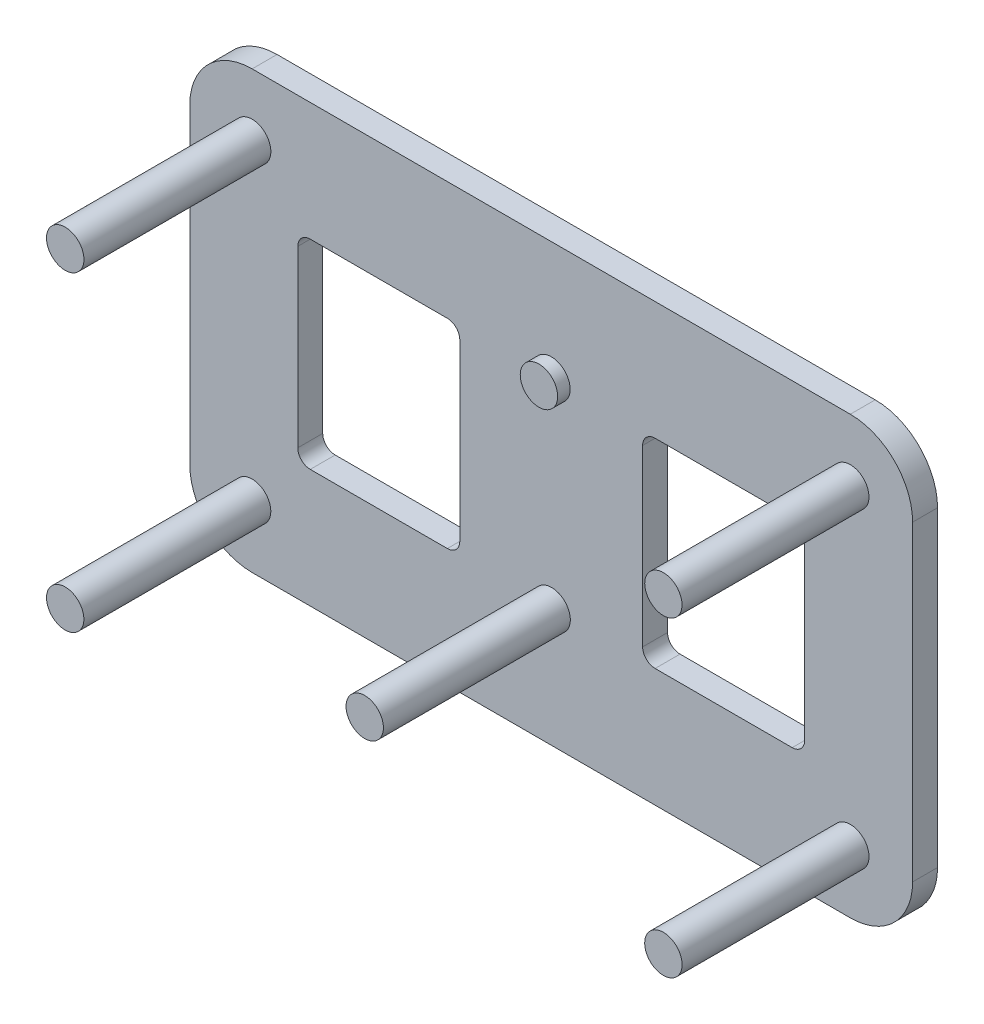
ISO-10303-21;
HEADER;
FILE_DESCRIPTION(('STEP AP214'),'2;1');
FILE_NAME('part.step','',(''),(''),'','','');
FILE_SCHEMA(('AUTOMOTIVE_DESIGN { 1 0 10303 214 1 1 1 1 }'));
ENDSEC;
DATA;
#1=APPLICATION_CONTEXT('core data for automotive mechanical design processes');
#2=APPLICATION_PROTOCOL_DEFINITION('international standard','automotive_design',2000,#1);
#3=PRODUCT_CONTEXT('',#1,'mechanical');
#4=PRODUCT('Part','Part','',(#3));
#5=PRODUCT_RELATED_PRODUCT_CATEGORY('part','',(#4));
#6=PRODUCT_DEFINITION_FORMATION('','',#4);
#7=PRODUCT_DEFINITION_CONTEXT('part definition',#1,'design');
#8=PRODUCT_DEFINITION('design','',#6,#7);
#9=PRODUCT_DEFINITION_SHAPE('','',#8);
#10=(LENGTH_UNIT() NAMED_UNIT(*) SI_UNIT(.MILLI.,.METRE.));
#11=(NAMED_UNIT(*) PLANE_ANGLE_UNIT() SI_UNIT($,.RADIAN.));
#12=(NAMED_UNIT(*) SI_UNIT($,.STERADIAN.) SOLID_ANGLE_UNIT());
#13=UNCERTAINTY_MEASURE_WITH_UNIT(LENGTH_MEASURE(1.E-05),#10,'distance_accuracy_value','');
#14=(GEOMETRIC_REPRESENTATION_CONTEXT(3) GLOBAL_UNCERTAINTY_ASSIGNED_CONTEXT((#13)) GLOBAL_UNIT_ASSIGNED_CONTEXT((#10,
#11,#12)) REPRESENTATION_CONTEXT('',''));
#15=CARTESIAN_POINT('',(0.,0.,0.));
#16=DIRECTION('',(0.,0.,1.));
#17=DIRECTION('',(1.,0.,0.));
#18=AXIS2_PLACEMENT_3D('',#15,#16,#17);
#19=CARTESIAN_POINT('',(0.,0.,2.));
#20=DIRECTION('',(-1.,0.,0.));
#21=DIRECTION('',(0.,0.,1.));
#22=AXIS2_PLACEMENT_3D('',#19,#20,#21);
#23=PLANE('',#22);
#24=DIRECTION('',(0.,1.,0.));
#25=VECTOR('',#24,1.);
#26=CARTESIAN_POINT('',(0.,0.,0.));
#27=LINE('',#26,#25);
#28=CARTESIAN_POINT('',(0.,5.,0.));
#29=VERTEX_POINT('',#28);
#30=CARTESIAN_POINT('',(0.,30.,0.));
#31=VERTEX_POINT('',#30);
#32=EDGE_CURVE('E203',#29,#31,#27,.T.);
#33=ORIENTED_EDGE('',*,*,#32,.F.);
#34=DIRECTION('',(0.,0.,-1.));
#35=VECTOR('',#34,1.);
#36=CARTESIAN_POINT('',(0.,5.,2.));
#37=LINE('',#36,#35);
#38=CARTESIAN_POINT('',(0.,5.,2.));
#39=VERTEX_POINT('',#38);
#40=EDGE_CURVE('E257',#29,#39,#37,.F.);
#41=ORIENTED_EDGE('',*,*,#40,.T.);
#42=DIRECTION('',(0.,1.,0.));
#43=VECTOR('',#42,1.);
#44=CARTESIAN_POINT('',(0.,0.,2.));
#45=LINE('',#44,#43);
#46=CARTESIAN_POINT('',(0.,30.,2.));
#47=VERTEX_POINT('',#46);
#48=EDGE_CURVE('E401',#39,#47,#45,.T.);
#49=ORIENTED_EDGE('',*,*,#48,.T.);
#50=DIRECTION('',(0.,0.,-1.));
#51=VECTOR('',#50,1.);
#52=CARTESIAN_POINT('',(0.,30.,2.));
#53=LINE('',#52,#51);
#54=EDGE_CURVE('E255',#47,#31,#53,.T.);
#55=ORIENTED_EDGE('',*,*,#54,.T.);
#56=EDGE_LOOP('',(#33,#41,#49,#55));
#57=FACE_BOUND('',#56,.T.);
#58=ADVANCED_FACE('F35',(#57),#23,.T.);
#59=CARTESIAN_POINT('',(0.,0.,2.));
#60=DIRECTION('',(0.,1.,0.));
#61=DIRECTION('',(0.,0.,1.));
#62=AXIS2_PLACEMENT_3D('',#59,#60,#61);
#63=PLANE('',#62);
#64=DIRECTION('',(1.,0.,0.));
#65=VECTOR('',#64,1.);
#66=CARTESIAN_POINT('',(0.,0.,2.));
#67=LINE('',#66,#65);
#68=CARTESIAN_POINT('',(5.,0.,2.));
#69=VERTEX_POINT('',#68);
#70=CARTESIAN_POINT('',(53.,0.,2.));
#71=VERTEX_POINT('',#70);
#72=EDGE_CURVE('E224',#69,#71,#67,.T.);
#73=ORIENTED_EDGE('',*,*,#72,.F.);
#74=DIRECTION('',(0.,0.,-1.));
#75=VECTOR('',#74,1.);
#76=CARTESIAN_POINT('',(5.,0.,0.));
#77=LINE('',#76,#75);
#78=CARTESIAN_POINT('',(5.,0.,0.));
#79=VERTEX_POINT('',#78);
#80=EDGE_CURVE('E252',#69,#79,#77,.T.);
#81=ORIENTED_EDGE('',*,*,#80,.T.);
#82=DIRECTION('',(1.,0.,0.));
#83=VECTOR('',#82,1.);
#84=CARTESIAN_POINT('',(0.,0.,0.));
#85=LINE('',#84,#83);
#86=CARTESIAN_POINT('',(53.,0.,0.));
#87=VERTEX_POINT('',#86);
#88=EDGE_CURVE('E231',#79,#87,#85,.T.);
#89=ORIENTED_EDGE('',*,*,#88,.T.);
#90=DIRECTION('',(0.,0.,-1.));
#91=VECTOR('',#90,1.);
#92=CARTESIAN_POINT('',(53.,0.,2.));
#93=LINE('',#92,#91);
#94=EDGE_CURVE('E250',#87,#71,#93,.F.);
#95=ORIENTED_EDGE('',*,*,#94,.T.);
#96=EDGE_LOOP('',(#73,#81,#89,#95));
#97=FACE_BOUND('',#96,.T.);
#98=ADVANCED_FACE('F462',(#97),#63,.F.);
#99=CARTESIAN_POINT('',(58.,0.,2.));
#100=DIRECTION('',(-1.,0.,0.));
#101=DIRECTION('',(0.,0.,1.));
#102=AXIS2_PLACEMENT_3D('',#99,#100,#101);
#103=PLANE('',#102);
#104=DIRECTION('',(0.,1.,0.));
#105=VECTOR('',#104,1.);
#106=CARTESIAN_POINT('',(58.,0.,0.));
#107=LINE('',#106,#105);
#108=CARTESIAN_POINT('',(58.,5.,0.));
#109=VERTEX_POINT('',#108);
#110=CARTESIAN_POINT('',(58.,30.,0.));
#111=VERTEX_POINT('',#110);
#112=EDGE_CURVE('E219',#109,#111,#107,.T.);
#113=ORIENTED_EDGE('',*,*,#112,.T.);
#114=DIRECTION('',(0.,0.,-1.));
#115=VECTOR('',#114,1.);
#116=CARTESIAN_POINT('',(58.,30.,2.));
#117=LINE('',#116,#115);
#118=CARTESIAN_POINT('',(58.,30.,2.));
#119=VERTEX_POINT('',#118);
#120=EDGE_CURVE('E241',#111,#119,#117,.F.);
#121=ORIENTED_EDGE('',*,*,#120,.T.);
#122=DIRECTION('',(0.,1.,0.));
#123=VECTOR('',#122,1.);
#124=CARTESIAN_POINT('',(58.,0.,2.));
#125=LINE('',#124,#123);
#126=CARTESIAN_POINT('',(58.,5.,2.));
#127=VERTEX_POINT('',#126);
#128=EDGE_CURVE('E228',#127,#119,#125,.T.);
#129=ORIENTED_EDGE('',*,*,#128,.F.);
#130=DIRECTION('',(0.,0.,-1.));
#131=VECTOR('',#130,1.);
#132=CARTESIAN_POINT('',(58.,5.,2.));
#133=LINE('',#132,#131);
#134=EDGE_CURVE('E238',#127,#109,#133,.T.);
#135=ORIENTED_EDGE('',*,*,#134,.T.);
#136=EDGE_LOOP('',(#113,#121,#129,#135));
#137=FACE_BOUND('',#136,.T.);
#138=ADVANCED_FACE('F399',(#137),#103,.F.);
#139=CARTESIAN_POINT('',(0.,35.,2.));
#140=DIRECTION('',(0.,1.,0.));
#141=DIRECTION('',(0.,0.,1.));
#142=AXIS2_PLACEMENT_3D('',#139,#140,#141);
#143=PLANE('',#142);
#144=DIRECTION('',(1.,0.,0.));
#145=VECTOR('',#144,1.);
#146=CARTESIAN_POINT('',(0.,35.,2.));
#147=LINE('',#146,#145);
#148=CARTESIAN_POINT('',(5.,35.,2.));
#149=VERTEX_POINT('',#148);
#150=CARTESIAN_POINT('',(53.,35.,2.));
#151=VERTEX_POINT('',#150);
#152=EDGE_CURVE('E392',#149,#151,#147,.T.);
#153=ORIENTED_EDGE('',*,*,#152,.T.);
#154=DIRECTION('',(0.,0.,-1.));
#155=VECTOR('',#154,1.);
#156=CARTESIAN_POINT('',(53.,35.,0.));
#157=LINE('',#156,#155);
#158=CARTESIAN_POINT('',(53.,35.,0.));
#159=VERTEX_POINT('',#158);
#160=EDGE_CURVE('E218',#151,#159,#157,.T.);
#161=ORIENTED_EDGE('',*,*,#160,.T.);
#162=DIRECTION('',(1.,0.,0.));
#163=VECTOR('',#162,1.);
#164=CARTESIAN_POINT('',(0.,35.,0.));
#165=LINE('',#164,#163);
#166=CARTESIAN_POINT('',(5.,35.,0.));
#167=VERTEX_POINT('',#166);
#168=EDGE_CURVE('E201',#167,#159,#165,.T.);
#169=ORIENTED_EDGE('',*,*,#168,.F.);
#170=DIRECTION('',(0.,0.,-1.));
#171=VECTOR('',#170,1.);
#172=CARTESIAN_POINT('',(5.,35.,2.));
#173=LINE('',#172,#171);
#174=EDGE_CURVE('E215',#167,#149,#173,.F.);
#175=ORIENTED_EDGE('',*,*,#174,.T.);
#176=EDGE_LOOP('',(#153,#161,#169,#175));
#177=FACE_BOUND('',#176,.T.);
#178=ADVANCED_FACE('F214',(#177),#143,.T.);
#179=CARTESIAN_POINT('',(0.,0.,2.));
#180=DIRECTION('',(0.,0.,-1.));
#181=DIRECTION('',(-1.,0.,0.));
#182=AXIS2_PLACEMENT_3D('',#179,#180,#181);
#183=PLANE('',#182);
#184=CARTESIAN_POINT('',(29.0349767991476,9.47649567218889,2.));
#185=DIRECTION('',(0.,0.,-1.));
#186=DIRECTION('',(-1.,0.,0.));
#187=AXIS2_PLACEMENT_3D('',#184,#185,#186);
#188=CIRCLE('',#187,1.499079917388);
#189=CARTESIAN_POINT('',(27.5358968817596,9.47649567218889,2.));
#190=VERTEX_POINT('',#189);
#191=EDGE_CURVE('E11',#190,#190,#188,.F.);
#192=ORIENTED_EDGE('',*,*,#191,.F.);
#193=EDGE_LOOP('',(#192));
#194=FACE_BOUND('',#193,.T.);
#195=CARTESIAN_POINT('',(29.0154819729338,25.4960200280294,2.));
#196=DIRECTION('',(0.,0.,-1.));
#197=DIRECTION('',(-1.,0.,0.));
#198=AXIS2_PLACEMENT_3D('',#195,#196,#197);
#199=CIRCLE('',#198,1.50195825573664);
#200=CARTESIAN_POINT('',(27.5135237171972,25.4960200280294,2.));
#201=VERTEX_POINT('',#200);
#202=EDGE_CURVE('E43',#201,#201,#199,.F.);
#203=ORIENTED_EDGE('',*,*,#202,.F.);
#204=EDGE_LOOP('',(#203));
#205=FACE_BOUND('',#204,.T.);
#206=DIRECTION('',(-1.,0.,0.));
#207=VECTOR('',#206,1.);
#208=CARTESIAN_POINT('',(36.3358181515225,25.5,2.));
#209=LINE('',#208,#207);
#210=CARTESIAN_POINT('',(48.3358181515225,25.5,2.));
#211=VERTEX_POINT('',#210);
#212=CARTESIAN_POINT('',(37.3358181515225,25.5,2.));
#213=VERTEX_POINT('',#212);
#214=EDGE_CURVE('E375',#211,#213,#209,.T.);
#215=ORIENTED_EDGE('',*,*,#214,.F.);
#216=CARTESIAN_POINT('',(48.3358181515225,24.5,2.));
#217=DIRECTION('',(0.,0.,-1.));
#218=DIRECTION('',(-1.,0.,0.));
#219=AXIS2_PLACEMENT_3D('',#216,#217,#218);
#220=CIRCLE('',#219,1.);
#221=CARTESIAN_POINT('',(49.3358181515225,24.5,2.));
#222=VERTEX_POINT('',#221);
#223=EDGE_CURVE('E354',#211,#222,#220,.T.);
#224=ORIENTED_EDGE('',*,*,#223,.T.);
#225=DIRECTION('',(0.,1.,0.));
#226=VECTOR('',#225,1.);
#227=CARTESIAN_POINT('',(49.3358181515225,25.5,2.));
#228=LINE('',#227,#226);
#229=CARTESIAN_POINT('',(49.3358181515225,10.5,2.));
#230=VERTEX_POINT('',#229);
#231=EDGE_CURVE('E423',#230,#222,#228,.T.);
#232=ORIENTED_EDGE('',*,*,#231,.F.);
#233=CARTESIAN_POINT('',(48.3358181515225,10.5,2.));
#234=DIRECTION('',(0.,0.,-1.));
#235=DIRECTION('',(-1.,0.,0.));
#236=AXIS2_PLACEMENT_3D('',#233,#234,#235);
#237=CIRCLE('',#236,1.);
#238=CARTESIAN_POINT('',(48.3358181515225,9.5,2.));
#239=VERTEX_POINT('',#238);
#240=EDGE_CURVE('E334',#230,#239,#237,.T.);
#241=ORIENTED_EDGE('',*,*,#240,.T.);
#242=DIRECTION('',(1.,0.,0.));
#243=VECTOR('',#242,1.);
#244=CARTESIAN_POINT('',(36.3358181515225,9.5,2.));
#245=LINE('',#244,#243);
#246=CARTESIAN_POINT('',(37.3358181515225,9.5,2.));
#247=VERTEX_POINT('',#246);
#248=EDGE_CURVE('E419',#247,#239,#245,.T.);
#249=ORIENTED_EDGE('',*,*,#248,.F.);
#250=CARTESIAN_POINT('',(37.3358181515225,10.5,2.));
#251=DIRECTION('',(0.,0.,-1.));
#252=DIRECTION('',(-1.,0.,0.));
#253=AXIS2_PLACEMENT_3D('',#250,#251,#252);
#254=CIRCLE('',#253,1.);
#255=CARTESIAN_POINT('',(36.3358181515225,10.5,2.));
#256=VERTEX_POINT('',#255);
#257=EDGE_CURVE('E342',#247,#256,#254,.T.);
#258=ORIENTED_EDGE('',*,*,#257,.T.);
#259=DIRECTION('',(0.,-1.,0.));
#260=VECTOR('',#259,1.);
#261=CARTESIAN_POINT('',(36.3358181515225,25.5,2.));
#262=LINE('',#261,#260);
#263=CARTESIAN_POINT('',(36.3358181515225,24.5,2.));
#264=VERTEX_POINT('',#263);
#265=EDGE_CURVE('E434',#264,#256,#262,.T.);
#266=ORIENTED_EDGE('',*,*,#265,.F.);
#267=CARTESIAN_POINT('',(37.3358181515225,24.5,2.));
#268=DIRECTION('',(0.,0.,-1.));
#269=DIRECTION('',(-1.,0.,0.));
#270=AXIS2_PLACEMENT_3D('',#267,#268,#269);
#271=CIRCLE('',#270,1.);
#272=EDGE_CURVE('E350',#264,#213,#271,.T.);
#273=ORIENTED_EDGE('',*,*,#272,.T.);
#274=EDGE_LOOP('',(#215,#224,#232,#241,#249,#258,#266,#273));
#275=FACE_BOUND('',#274,.T.);
#276=DIRECTION('',(-1.,0.,0.));
#277=VECTOR('',#276,1.);
#278=CARTESIAN_POINT('',(21.6641818484775,25.5,2.));
#279=LINE('',#278,#277);
#280=CARTESIAN_POINT('',(20.6641818484775,25.5,2.));
#281=VERTEX_POINT('',#280);
#282=CARTESIAN_POINT('',(9.66418184847753,25.5,2.));
#283=VERTEX_POINT('',#282);
#284=EDGE_CURVE('E377',#281,#283,#279,.T.);
#285=ORIENTED_EDGE('',*,*,#284,.F.);
#286=CARTESIAN_POINT('',(20.6641818484775,24.5,2.));
#287=DIRECTION('',(0.,0.,-1.));
#288=DIRECTION('',(-1.,0.,0.));
#289=AXIS2_PLACEMENT_3D('',#286,#287,#288);
#290=CIRCLE('',#289,1.);
#291=CARTESIAN_POINT('',(21.6641818484775,24.5,2.));
#292=VERTEX_POINT('',#291);
#293=EDGE_CURVE('E58',#281,#292,#290,.T.);
#294=ORIENTED_EDGE('',*,*,#293,.T.);
#295=DIRECTION('',(0.,1.,0.));
#296=VECTOR('',#295,1.);
#297=CARTESIAN_POINT('',(21.6641818484775,25.5,2.));
#298=LINE('',#297,#296);
#299=CARTESIAN_POINT('',(21.6641818484775,10.5,2.));
#300=VERTEX_POINT('',#299);
#301=EDGE_CURVE('E428',#300,#292,#298,.T.);
#302=ORIENTED_EDGE('',*,*,#301,.F.);
#303=CARTESIAN_POINT('',(20.6641818484775,10.5,2.));
#304=DIRECTION('',(0.,0.,-1.));
#305=DIRECTION('',(-1.,0.,0.));
#306=AXIS2_PLACEMENT_3D('',#303,#304,#305);
#307=CIRCLE('',#306,1.);
#308=CARTESIAN_POINT('',(20.6641818484775,9.5,2.));
#309=VERTEX_POINT('',#308);
#310=EDGE_CURVE('E338',#300,#309,#307,.T.);
#311=ORIENTED_EDGE('',*,*,#310,.T.);
#312=DIRECTION('',(1.,0.,0.));
#313=VECTOR('',#312,1.);
#314=CARTESIAN_POINT('',(21.6641818484775,9.5,2.));
#315=LINE('',#314,#313);
#316=CARTESIAN_POINT('',(9.66418184847753,9.5,2.));
#317=VERTEX_POINT('',#316);
#318=EDGE_CURVE('E420',#317,#309,#315,.T.);
#319=ORIENTED_EDGE('',*,*,#318,.F.);
#320=CARTESIAN_POINT('',(9.66418184847753,10.5,2.));
#321=DIRECTION('',(0.,0.,-1.));
#322=DIRECTION('',(-1.,0.,0.));
#323=AXIS2_PLACEMENT_3D('',#320,#321,#322);
#324=CIRCLE('',#323,1.);
#325=CARTESIAN_POINT('',(8.66418184847752,10.5,2.));
#326=VERTEX_POINT('',#325);
#327=EDGE_CURVE('E346',#317,#326,#324,.T.);
#328=ORIENTED_EDGE('',*,*,#327,.T.);
#329=DIRECTION('',(0.,-1.,0.));
#330=VECTOR('',#329,1.);
#331=CARTESIAN_POINT('',(8.66418184847752,25.5,2.));
#332=LINE('',#331,#330);
#333=CARTESIAN_POINT('',(8.66418184847752,24.5,2.));
#334=VERTEX_POINT('',#333);
#335=EDGE_CURVE('E424',#334,#326,#332,.T.);
#336=ORIENTED_EDGE('',*,*,#335,.F.);
#337=CARTESIAN_POINT('',(9.66418184847753,24.5,2.));
#338=DIRECTION('',(0.,0.,-1.));
#339=DIRECTION('',(-1.,0.,0.));
#340=AXIS2_PLACEMENT_3D('',#337,#338,#339);
#341=CIRCLE('',#340,1.);
#342=EDGE_CURVE('E50',#334,#283,#341,.T.);
#343=ORIENTED_EDGE('',*,*,#342,.T.);
#344=EDGE_LOOP('',(#285,#294,#302,#311,#319,#328,#336,#343));
#345=FACE_BOUND('',#344,.T.);
#346=CARTESIAN_POINT('',(53.,5.,2.));
#347=DIRECTION('',(0.,0.,-1.));
#348=DIRECTION('',(-1.,0.,0.));
#349=AXIS2_PLACEMENT_3D('',#346,#347,#348);
#350=CIRCLE('',#349,1.50046723626468);
#351=CARTESIAN_POINT('',(51.4995327637353,5.,2.));
#352=VERTEX_POINT('',#351);
#353=EDGE_CURVE('E268',#352,#352,#350,.F.);
#354=ORIENTED_EDGE('',*,*,#353,.F.);
#355=EDGE_LOOP('',(#354));
#356=FACE_BOUND('',#355,.T.);
#357=CARTESIAN_POINT('',(5.,5.,2.));
#358=DIRECTION('',(0.,0.,-1.));
#359=DIRECTION('',(-1.,0.,0.));
#360=AXIS2_PLACEMENT_3D('',#357,#358,#359);
#361=CIRCLE('',#360,1.49828705108887);
#362=CARTESIAN_POINT('',(3.50171294891113,5.,2.));
#363=VERTEX_POINT('',#362);
#364=EDGE_CURVE('E265',#363,#363,#361,.F.);
#365=ORIENTED_EDGE('',*,*,#364,.F.);
#366=EDGE_LOOP('',(#365));
#367=FACE_BOUND('',#366,.T.);
#368=CARTESIAN_POINT('',(4.9999670068715,30.,2.));
#369=DIRECTION('',(0.,0.,-1.));
#370=DIRECTION('',(-1.,0.,0.));
#371=AXIS2_PLACEMENT_3D('',#368,#369,#370);
#372=CIRCLE('',#371,1.50351088676342);
#373=CARTESIAN_POINT('',(3.49645612010808,30.,2.));
#374=VERTEX_POINT('',#373);
#375=EDGE_CURVE('E262',#374,#374,#372,.F.);
#376=ORIENTED_EDGE('',*,*,#375,.F.);
#377=EDGE_LOOP('',(#376));
#378=FACE_BOUND('',#377,.T.);
#379=CARTESIAN_POINT('',(53.,30.,2.));
#380=DIRECTION('',(0.,0.,-1.));
#381=DIRECTION('',(-1.,0.,0.));
#382=AXIS2_PLACEMENT_3D('',#379,#380,#381);
#383=CIRCLE('',#382,1.4967718757162);
#384=CARTESIAN_POINT('',(51.5032281242838,30.,2.));
#385=VERTEX_POINT('',#384);
#386=EDGE_CURVE('E259',#385,#385,#383,.F.);
#387=ORIENTED_EDGE('',*,*,#386,.F.);
#388=EDGE_LOOP('',(#387));
#389=FACE_BOUND('',#388,.T.);
#390=ORIENTED_EDGE('',*,*,#128,.T.);
#391=CARTESIAN_POINT('',(53.,30.,2.));
#392=DIRECTION('',(0.,0.,-1.));
#393=DIRECTION('',(-1.,0.,0.));
#394=AXIS2_PLACEMENT_3D('',#391,#392,#393);
#395=CIRCLE('',#394,5.);
#396=EDGE_CURVE('E248',#119,#151,#395,.F.);
#397=ORIENTED_EDGE('',*,*,#396,.T.);
#398=ORIENTED_EDGE('',*,*,#152,.F.);
#399=CARTESIAN_POINT('',(5.,30.,2.));
#400=DIRECTION('',(0.,0.,-1.));
#401=DIRECTION('',(-1.,0.,0.));
#402=AXIS2_PLACEMENT_3D('',#399,#400,#401);
#403=CIRCLE('',#402,5.);
#404=EDGE_CURVE('E223',#149,#47,#403,.F.);
#405=ORIENTED_EDGE('',*,*,#404,.T.);
#406=ORIENTED_EDGE('',*,*,#48,.F.);
#407=CARTESIAN_POINT('',(5.,5.,2.));
#408=DIRECTION('',(0.,0.,-1.));
#409=DIRECTION('',(-1.,0.,0.));
#410=AXIS2_PLACEMENT_3D('',#407,#408,#409);
#411=CIRCLE('',#410,5.);
#412=EDGE_CURVE('E246',#39,#69,#411,.F.);
#413=ORIENTED_EDGE('',*,*,#412,.T.);
#414=ORIENTED_EDGE('',*,*,#72,.T.);
#415=CARTESIAN_POINT('',(53.,5.,2.));
#416=DIRECTION('',(0.,0.,-1.));
#417=DIRECTION('',(-1.,0.,0.));
#418=AXIS2_PLACEMENT_3D('',#415,#416,#417);
#419=CIRCLE('',#418,5.);
#420=EDGE_CURVE('E243',#71,#127,#419,.F.);
#421=ORIENTED_EDGE('',*,*,#420,.T.);
#422=EDGE_LOOP('',(#390,#397,#398,#405,#406,#413,#414,#421));
#423=FACE_BOUND('',#422,.T.);
#424=ADVANCED_FACE('F368',(#194,#205,#275,#345,#356,#367,#378,#389,#423),#183,.F.);
#425=CARTESIAN_POINT('',(0.,0.,0.));
#426=DIRECTION('',(0.,0.,-1.));
#427=DIRECTION('',(-1.,0.,0.));
#428=AXIS2_PLACEMENT_3D('',#425,#426,#427);
#429=PLANE('',#428);
#430=DIRECTION('',(0.,-1.,0.));
#431=VECTOR('',#430,1.);
#432=CARTESIAN_POINT('',(49.3358181515225,0.,0.));
#433=LINE('',#432,#431);
#434=CARTESIAN_POINT('',(49.3358181515225,24.5,0.));
#435=VERTEX_POINT('',#434);
#436=CARTESIAN_POINT('',(49.3358181515225,10.5,0.));
#437=VERTEX_POINT('',#436);
#438=EDGE_CURVE('E292',#435,#437,#433,.T.);
#439=ORIENTED_EDGE('',*,*,#438,.F.);
#440=CARTESIAN_POINT('',(48.3358181515225,24.5,0.));
#441=DIRECTION('',(0.,0.,-1.));
#442=DIRECTION('',(-1.,0.,0.));
#443=AXIS2_PLACEMENT_3D('',#440,#441,#442);
#444=CIRCLE('',#443,1.);
#445=CARTESIAN_POINT('',(48.3358181515225,25.5,0.));
#446=VERTEX_POINT('',#445);
#447=EDGE_CURVE('E356',#435,#446,#444,.F.);
#448=ORIENTED_EDGE('',*,*,#447,.T.);
#449=DIRECTION('',(1.,0.,0.));
#450=VECTOR('',#449,1.);
#451=CARTESIAN_POINT('',(0.,25.5,0.));
#452=LINE('',#451,#450);
#453=CARTESIAN_POINT('',(37.3358181515225,25.5,0.));
#454=VERTEX_POINT('',#453);
#455=EDGE_CURVE('E283',#454,#446,#452,.T.);
#456=ORIENTED_EDGE('',*,*,#455,.F.);
#457=CARTESIAN_POINT('',(37.3358181515225,24.5,0.));
#458=DIRECTION('',(0.,0.,-1.));
#459=DIRECTION('',(-1.,0.,0.));
#460=AXIS2_PLACEMENT_3D('',#457,#458,#459);
#461=CIRCLE('',#460,1.);
#462=CARTESIAN_POINT('',(36.3358181515225,24.5,0.));
#463=VERTEX_POINT('',#462);
#464=EDGE_CURVE('E352',#454,#463,#461,.F.);
#465=ORIENTED_EDGE('',*,*,#464,.T.);
#466=DIRECTION('',(0.,1.,0.));
#467=VECTOR('',#466,1.);
#468=CARTESIAN_POINT('',(36.3358181515225,0.,0.));
#469=LINE('',#468,#467);
#470=CARTESIAN_POINT('',(36.3358181515225,10.5,0.));
#471=VERTEX_POINT('',#470);
#472=EDGE_CURVE('E286',#471,#463,#469,.T.);
#473=ORIENTED_EDGE('',*,*,#472,.F.);
#474=CARTESIAN_POINT('',(37.3358181515225,10.5,0.));
#475=DIRECTION('',(0.,0.,-1.));
#476=DIRECTION('',(-1.,0.,0.));
#477=AXIS2_PLACEMENT_3D('',#474,#475,#476);
#478=CIRCLE('',#477,1.);
#479=CARTESIAN_POINT('',(37.3358181515225,9.5,0.));
#480=VERTEX_POINT('',#479);
#481=EDGE_CURVE('E344',#471,#480,#478,.F.);
#482=ORIENTED_EDGE('',*,*,#481,.T.);
#483=DIRECTION('',(-1.,0.,0.));
#484=VECTOR('',#483,1.);
#485=CARTESIAN_POINT('',(0.,9.5,0.));
#486=LINE('',#485,#484);
#487=CARTESIAN_POINT('',(48.3358181515225,9.5,0.));
#488=VERTEX_POINT('',#487);
#489=EDGE_CURVE('E289',#488,#480,#486,.T.);
#490=ORIENTED_EDGE('',*,*,#489,.F.);
#491=CARTESIAN_POINT('',(48.3358181515225,10.5,0.));
#492=DIRECTION('',(0.,0.,-1.));
#493=DIRECTION('',(-1.,0.,0.));
#494=AXIS2_PLACEMENT_3D('',#491,#492,#493);
#495=CIRCLE('',#494,1.);
#496=EDGE_CURVE('E336',#488,#437,#495,.F.);
#497=ORIENTED_EDGE('',*,*,#496,.T.);
#498=EDGE_LOOP('',(#439,#448,#456,#465,#473,#482,#490,#497));
#499=FACE_BOUND('',#498,.T.);
#500=DIRECTION('',(0.,-1.,0.));
#501=VECTOR('',#500,1.);
#502=CARTESIAN_POINT('',(21.6641818484775,0.,0.));
#503=LINE('',#502,#501);
#504=CARTESIAN_POINT('',(21.6641818484775,24.5,0.));
#505=VERTEX_POINT('',#504);
#506=CARTESIAN_POINT('',(21.6641818484775,10.5,0.));
#507=VERTEX_POINT('',#506);
#508=EDGE_CURVE('E280',#505,#507,#503,.T.);
#509=ORIENTED_EDGE('',*,*,#508,.F.);
#510=CARTESIAN_POINT('',(20.6641818484775,24.5,0.));
#511=DIRECTION('',(0.,0.,-1.));
#512=DIRECTION('',(-1.,0.,0.));
#513=AXIS2_PLACEMENT_3D('',#510,#511,#512);
#514=CIRCLE('',#513,1.);
#515=CARTESIAN_POINT('',(20.6641818484775,25.5,0.));
#516=VERTEX_POINT('',#515);
#517=EDGE_CURVE('E359',#505,#516,#514,.F.);
#518=ORIENTED_EDGE('',*,*,#517,.T.);
#519=DIRECTION('',(1.,0.,0.));
#520=VECTOR('',#519,1.);
#521=CARTESIAN_POINT('',(0.,25.5,0.));
#522=LINE('',#521,#520);
#523=CARTESIAN_POINT('',(9.66418184847753,25.5,0.));
#524=VERTEX_POINT('',#523);
#525=EDGE_CURVE('E271',#524,#516,#522,.T.);
#526=ORIENTED_EDGE('',*,*,#525,.F.);
#527=CARTESIAN_POINT('',(9.66418184847753,24.5,0.));
#528=DIRECTION('',(0.,0.,-1.));
#529=DIRECTION('',(-1.,0.,0.));
#530=AXIS2_PLACEMENT_3D('',#527,#528,#529);
#531=CIRCLE('',#530,1.);
#532=CARTESIAN_POINT('',(8.66418184847752,24.5,0.));
#533=VERTEX_POINT('',#532);
#534=EDGE_CURVE('E362',#524,#533,#531,.F.);
#535=ORIENTED_EDGE('',*,*,#534,.T.);
#536=DIRECTION('',(0.,1.,0.));
#537=VECTOR('',#536,1.);
#538=CARTESIAN_POINT('',(8.66418184847752,0.,0.));
#539=LINE('',#538,#537);
#540=CARTESIAN_POINT('',(8.66418184847752,10.5,0.));
#541=VERTEX_POINT('',#540);
#542=EDGE_CURVE('E274',#541,#533,#539,.T.);
#543=ORIENTED_EDGE('',*,*,#542,.F.);
#544=CARTESIAN_POINT('',(9.66418184847753,10.5,0.));
#545=DIRECTION('',(0.,0.,-1.));
#546=DIRECTION('',(-1.,0.,0.));
#547=AXIS2_PLACEMENT_3D('',#544,#545,#546);
#548=CIRCLE('',#547,1.);
#549=CARTESIAN_POINT('',(9.66418184847753,9.5,0.));
#550=VERTEX_POINT('',#549);
#551=EDGE_CURVE('E348',#541,#550,#548,.F.);
#552=ORIENTED_EDGE('',*,*,#551,.T.);
#553=DIRECTION('',(-1.,0.,0.));
#554=VECTOR('',#553,1.);
#555=CARTESIAN_POINT('',(0.,9.5,0.));
#556=LINE('',#555,#554);
#557=CARTESIAN_POINT('',(20.6641818484775,9.5,0.));
#558=VERTEX_POINT('',#557);
#559=EDGE_CURVE('E277',#558,#550,#556,.T.);
#560=ORIENTED_EDGE('',*,*,#559,.F.);
#561=CARTESIAN_POINT('',(20.6641818484775,10.5,0.));
#562=DIRECTION('',(0.,0.,-1.));
#563=DIRECTION('',(-1.,0.,0.));
#564=AXIS2_PLACEMENT_3D('',#561,#562,#563);
#565=CIRCLE('',#564,1.);
#566=EDGE_CURVE('E340',#558,#507,#565,.F.);
#567=ORIENTED_EDGE('',*,*,#566,.T.);
#568=EDGE_LOOP('',(#509,#518,#526,#535,#543,#552,#560,#567));
#569=FACE_BOUND('',#568,.T.);
#570=ORIENTED_EDGE('',*,*,#168,.T.);
#571=CARTESIAN_POINT('',(53.,30.,0.));
#572=DIRECTION('',(0.,0.,-1.));
#573=DIRECTION('',(-1.,0.,0.));
#574=AXIS2_PLACEMENT_3D('',#571,#572,#573);
#575=CIRCLE('',#574,5.);
#576=EDGE_CURVE('E236',#159,#111,#575,.T.);
#577=ORIENTED_EDGE('',*,*,#576,.T.);
#578=ORIENTED_EDGE('',*,*,#112,.F.);
#579=CARTESIAN_POINT('',(53.,5.,0.));
#580=DIRECTION('',(0.,0.,-1.));
#581=DIRECTION('',(-1.,0.,0.));
#582=AXIS2_PLACEMENT_3D('',#579,#580,#581);
#583=CIRCLE('',#582,5.);
#584=EDGE_CURVE('E209',#109,#87,#583,.T.);
#585=ORIENTED_EDGE('',*,*,#584,.T.);
#586=ORIENTED_EDGE('',*,*,#88,.F.);
#587=CARTESIAN_POINT('',(5.,5.,0.));
#588=DIRECTION('',(0.,0.,-1.));
#589=DIRECTION('',(-1.,0.,0.));
#590=AXIS2_PLACEMENT_3D('',#587,#588,#589);
#591=CIRCLE('',#590,5.);
#592=EDGE_CURVE('E208',#79,#29,#591,.T.);
#593=ORIENTED_EDGE('',*,*,#592,.T.);
#594=ORIENTED_EDGE('',*,*,#32,.T.);
#595=CARTESIAN_POINT('',(5.,30.,0.));
#596=DIRECTION('',(0.,0.,-1.));
#597=DIRECTION('',(-1.,0.,0.));
#598=AXIS2_PLACEMENT_3D('',#595,#596,#597);
#599=CIRCLE('',#598,5.);
#600=EDGE_CURVE('E198',#31,#167,#599,.T.);
#601=ORIENTED_EDGE('',*,*,#600,.T.);
#602=EDGE_LOOP('',(#570,#577,#578,#585,#586,#593,#594,#601));
#603=FACE_BOUND('',#602,.T.);
#604=ADVANCED_FACE('F200',(#499,#569,#603),#429,.T.);
#605=CARTESIAN_POINT('',(53.,30.,2.));
#606=DIRECTION('',(0.,0.,1.));
#607=DIRECTION('',(1.,0.,0.));
#608=AXIS2_PLACEMENT_3D('',#605,#606,#607);
#609=CYLINDRICAL_SURFACE('',#608,5.);
#610=ORIENTED_EDGE('',*,*,#396,.F.);
#611=ORIENTED_EDGE('',*,*,#120,.F.);
#612=ORIENTED_EDGE('',*,*,#576,.F.);
#613=ORIENTED_EDGE('',*,*,#160,.F.);
#614=EDGE_LOOP('',(#610,#611,#612,#613));
#615=FACE_BOUND('',#614,.T.);
#616=ADVANCED_FACE('F396',(#615),#609,.T.);
#617=CARTESIAN_POINT('',(5.,5.,2.));
#618=DIRECTION('',(0.,0.,1.));
#619=DIRECTION('',(1.,0.,0.));
#620=AXIS2_PLACEMENT_3D('',#617,#618,#619);
#621=CYLINDRICAL_SURFACE('',#620,5.);
#622=ORIENTED_EDGE('',*,*,#412,.F.);
#623=ORIENTED_EDGE('',*,*,#40,.F.);
#624=ORIENTED_EDGE('',*,*,#592,.F.);
#625=ORIENTED_EDGE('',*,*,#80,.F.);
#626=EDGE_LOOP('',(#622,#623,#624,#625));
#627=FACE_BOUND('',#626,.T.);
#628=ADVANCED_FACE('F475',(#627),#621,.T.);
#629=CARTESIAN_POINT('',(5.,30.,2.));
#630=DIRECTION('',(0.,0.,-1.));
#631=DIRECTION('',(-1.,0.,0.));
#632=AXIS2_PLACEMENT_3D('',#629,#630,#631);
#633=CYLINDRICAL_SURFACE('',#632,5.);
#634=ORIENTED_EDGE('',*,*,#404,.F.);
#635=ORIENTED_EDGE('',*,*,#174,.F.);
#636=ORIENTED_EDGE('',*,*,#600,.F.);
#637=ORIENTED_EDGE('',*,*,#54,.F.);
#638=EDGE_LOOP('',(#634,#635,#636,#637));
#639=FACE_BOUND('',#638,.T.);
#640=ADVANCED_FACE('F222',(#639),#633,.T.);
#641=CARTESIAN_POINT('',(53.,5.,2.));
#642=DIRECTION('',(0.,0.,-1.));
#643=DIRECTION('',(-1.,0.,0.));
#644=AXIS2_PLACEMENT_3D('',#641,#642,#643);
#645=CYLINDRICAL_SURFACE('',#644,5.);
#646=ORIENTED_EDGE('',*,*,#420,.F.);
#647=ORIENTED_EDGE('',*,*,#94,.F.);
#648=ORIENTED_EDGE('',*,*,#584,.F.);
#649=ORIENTED_EDGE('',*,*,#134,.F.);
#650=EDGE_LOOP('',(#646,#647,#648,#649));
#651=FACE_BOUND('',#650,.T.);
#652=ADVANCED_FACE('F481',(#651),#645,.T.);
#653=CARTESIAN_POINT('',(53.,30.,17.));
#654=DIRECTION('',(0.,0.,-1.));
#655=DIRECTION('',(-1.,0.,0.));
#656=AXIS2_PLACEMENT_3D('',#653,#654,#655);
#657=CYLINDRICAL_SURFACE('',#656,1.4967718757162);
#658=CARTESIAN_POINT('',(53.,30.,17.));
#659=DIRECTION('',(0.,0.,1.));
#660=DIRECTION('',(1.,0.,0.));
#661=AXIS2_PLACEMENT_3D('',#658,#659,#660);
#662=CIRCLE('',#661,1.4967718757162);
#663=CARTESIAN_POINT('',(54.4967718757162,30.,17.));
#664=VERTEX_POINT('',#663);
#665=EDGE_CURVE('E403',#664,#664,#662,.T.);
#666=ORIENTED_EDGE('',*,*,#665,.F.);
#667=EDGE_LOOP('',(#666));
#668=FACE_BOUND('',#667,.T.);
#669=ORIENTED_EDGE('',*,*,#386,.T.);
#670=EDGE_LOOP('',(#669));
#671=FACE_BOUND('',#670,.T.);
#672=ADVANCED_FACE('F484',(#668,#671),#657,.T.);
#673=CARTESIAN_POINT('',(53.,30.,17.));
#674=DIRECTION('',(0.,0.,1.));
#675=DIRECTION('',(1.,0.,0.));
#676=AXIS2_PLACEMENT_3D('',#673,#674,#675);
#677=PLANE('',#676);
#678=ORIENTED_EDGE('',*,*,#665,.T.);
#679=EDGE_LOOP('',(#678));
#680=FACE_BOUND('',#679,.T.);
#681=ADVANCED_FACE('F573',(#680),#677,.T.);
#682=CARTESIAN_POINT('',(4.9999670068715,30.,17.));
#683=DIRECTION('',(0.,0.,-1.));
#684=DIRECTION('',(-1.,0.,0.));
#685=AXIS2_PLACEMENT_3D('',#682,#683,#684);
#686=CYLINDRICAL_SURFACE('',#685,1.50351088676342);
#687=CARTESIAN_POINT('',(4.9999670068715,30.,17.));
#688=DIRECTION('',(0.,0.,1.));
#689=DIRECTION('',(1.,0.,0.));
#690=AXIS2_PLACEMENT_3D('',#687,#688,#689);
#691=CIRCLE('',#690,1.50351088676342);
#692=CARTESIAN_POINT('',(6.50347789363492,30.,17.));
#693=VERTEX_POINT('',#692);
#694=EDGE_CURVE('E410',#693,#693,#691,.T.);
#695=ORIENTED_EDGE('',*,*,#694,.F.);
#696=EDGE_LOOP('',(#695));
#697=FACE_BOUND('',#696,.T.);
#698=ORIENTED_EDGE('',*,*,#375,.T.);
#699=EDGE_LOOP('',(#698));
#700=FACE_BOUND('',#699,.T.);
#701=ADVANCED_FACE('F569',(#697,#700),#686,.T.);
#702=CARTESIAN_POINT('',(4.9999670068715,30.,17.));
#703=DIRECTION('',(0.,0.,1.));
#704=DIRECTION('',(1.,0.,0.));
#705=AXIS2_PLACEMENT_3D('',#702,#703,#704);
#706=PLANE('',#705);
#707=ORIENTED_EDGE('',*,*,#694,.T.);
#708=EDGE_LOOP('',(#707));
#709=FACE_BOUND('',#708,.T.);
#710=ADVANCED_FACE('F565',(#709),#706,.T.);
#711=CARTESIAN_POINT('',(5.,5.,17.));
#712=DIRECTION('',(0.,0.,-1.));
#713=DIRECTION('',(-1.,0.,0.));
#714=AXIS2_PLACEMENT_3D('',#711,#712,#713);
#715=CYLINDRICAL_SURFACE('',#714,1.49828705108887);
#716=CARTESIAN_POINT('',(5.,5.,17.));
#717=DIRECTION('',(0.,0.,1.));
#718=DIRECTION('',(1.,0.,0.));
#719=AXIS2_PLACEMENT_3D('',#716,#717,#718);
#720=CIRCLE('',#719,1.49828705108887);
#721=CARTESIAN_POINT('',(6.49828705108887,5.,17.));
#722=VERTEX_POINT('',#721);
#723=EDGE_CURVE('E413',#722,#722,#720,.T.);
#724=ORIENTED_EDGE('',*,*,#723,.F.);
#725=EDGE_LOOP('',(#724));
#726=FACE_BOUND('',#725,.T.);
#727=ORIENTED_EDGE('',*,*,#364,.T.);
#728=EDGE_LOOP('',(#727));
#729=FACE_BOUND('',#728,.T.);
#730=ADVANCED_FACE('F561',(#726,#729),#715,.T.);
#731=CARTESIAN_POINT('',(5.,5.,17.));
#732=DIRECTION('',(0.,0.,1.));
#733=DIRECTION('',(1.,0.,0.));
#734=AXIS2_PLACEMENT_3D('',#731,#732,#733);
#735=PLANE('',#734);
#736=ORIENTED_EDGE('',*,*,#723,.T.);
#737=EDGE_LOOP('',(#736));
#738=FACE_BOUND('',#737,.T.);
#739=ADVANCED_FACE('F557',(#738),#735,.T.);
#740=CARTESIAN_POINT('',(53.,5.,17.));
#741=DIRECTION('',(0.,0.,-1.));
#742=DIRECTION('',(-1.,0.,0.));
#743=AXIS2_PLACEMENT_3D('',#740,#741,#742);
#744=CYLINDRICAL_SURFACE('',#743,1.50046723626468);
#745=CARTESIAN_POINT('',(53.,5.,17.));
#746=DIRECTION('',(0.,0.,1.));
#747=DIRECTION('',(1.,0.,0.));
#748=AXIS2_PLACEMENT_3D('',#745,#746,#747);
#749=CIRCLE('',#748,1.50046723626468);
#750=CARTESIAN_POINT('',(54.5004672362647,5.,17.));
#751=VERTEX_POINT('',#750);
#752=EDGE_CURVE('E416',#751,#751,#749,.T.);
#753=ORIENTED_EDGE('',*,*,#752,.F.);
#754=EDGE_LOOP('',(#753));
#755=FACE_BOUND('',#754,.T.);
#756=ORIENTED_EDGE('',*,*,#353,.T.);
#757=EDGE_LOOP('',(#756));
#758=FACE_BOUND('',#757,.T.);
#759=ADVANCED_FACE('F549',(#755,#758),#744,.T.);
#760=CARTESIAN_POINT('',(53.,5.,17.));
#761=DIRECTION('',(0.,0.,1.));
#762=DIRECTION('',(1.,0.,0.));
#763=AXIS2_PLACEMENT_3D('',#760,#761,#762);
#764=PLANE('',#763);
#765=ORIENTED_EDGE('',*,*,#752,.T.);
#766=EDGE_LOOP('',(#765));
#767=FACE_BOUND('',#766,.T.);
#768=ADVANCED_FACE('F542',(#767),#764,.T.);
#769=CARTESIAN_POINT('',(21.6641818484775,25.5,-13.));
#770=DIRECTION('',(1.,0.,0.));
#771=DIRECTION('',(0.,0.,-1.));
#772=AXIS2_PLACEMENT_3D('',#769,#770,#771);
#773=PLANE('',#772);
#774=ORIENTED_EDGE('',*,*,#508,.T.);
#775=DIRECTION('',(0.,0.,1.));
#776=VECTOR('',#775,1.);
#777=CARTESIAN_POINT('',(21.6641818484775,10.5,2.));
#778=LINE('',#777,#776);
#779=EDGE_CURVE('E307',#507,#300,#778,.T.);
#780=ORIENTED_EDGE('',*,*,#779,.T.);
#781=ORIENTED_EDGE('',*,*,#301,.T.);
#782=DIRECTION('',(0.,0.,1.));
#783=VECTOR('',#782,1.);
#784=CARTESIAN_POINT('',(21.6641818484775,24.5,0.));
#785=LINE('',#784,#783);
#786=EDGE_CURVE('E305',#292,#505,#785,.F.);
#787=ORIENTED_EDGE('',*,*,#786,.T.);
#788=EDGE_LOOP('',(#774,#780,#781,#787));
#789=FACE_BOUND('',#788,.T.);
#790=ADVANCED_FACE('F539',(#789),#773,.F.);
#791=CARTESIAN_POINT('',(21.6641818484775,9.5,-13.));
#792=DIRECTION('',(0.,-1.,0.));
#793=DIRECTION('',(0.,0.,-1.));
#794=AXIS2_PLACEMENT_3D('',#791,#792,#793);
#795=PLANE('',#794);
#796=ORIENTED_EDGE('',*,*,#318,.T.);
#797=DIRECTION('',(0.,0.,1.));
#798=VECTOR('',#797,1.);
#799=CARTESIAN_POINT('',(20.6641818484775,9.5,0.));
#800=LINE('',#799,#798);
#801=EDGE_CURVE('E313',#309,#558,#800,.F.);
#802=ORIENTED_EDGE('',*,*,#801,.T.);
#803=ORIENTED_EDGE('',*,*,#559,.T.);
#804=DIRECTION('',(0.,0.,1.));
#805=VECTOR('',#804,1.);
#806=CARTESIAN_POINT('',(9.66418184847753,9.5,2.));
#807=LINE('',#806,#805);
#808=EDGE_CURVE('E310',#550,#317,#807,.T.);
#809=ORIENTED_EDGE('',*,*,#808,.T.);
#810=EDGE_LOOP('',(#796,#802,#803,#809));
#811=FACE_BOUND('',#810,.T.);
#812=ADVANCED_FACE('F534',(#811),#795,.F.);
#813=CARTESIAN_POINT('',(8.66418184847752,25.5,-13.));
#814=DIRECTION('',(-1.,0.,0.));
#815=DIRECTION('',(0.,0.,1.));
#816=AXIS2_PLACEMENT_3D('',#813,#814,#815);
#817=PLANE('',#816);
#818=ORIENTED_EDGE('',*,*,#335,.T.);
#819=DIRECTION('',(0.,0.,1.));
#820=VECTOR('',#819,1.);
#821=CARTESIAN_POINT('',(8.66418184847752,10.5,0.));
#822=LINE('',#821,#820);
#823=EDGE_CURVE('E323',#326,#541,#822,.F.);
#824=ORIENTED_EDGE('',*,*,#823,.T.);
#825=ORIENTED_EDGE('',*,*,#542,.T.);
#826=DIRECTION('',(0.,0.,1.));
#827=VECTOR('',#826,1.);
#828=CARTESIAN_POINT('',(8.66418184847752,24.5,2.));
#829=LINE('',#828,#827);
#830=EDGE_CURVE('E320',#533,#334,#829,.T.);
#831=ORIENTED_EDGE('',*,*,#830,.T.);
#832=EDGE_LOOP('',(#818,#824,#825,#831));
#833=FACE_BOUND('',#832,.T.);
#834=ADVANCED_FACE('F528',(#833),#817,.F.);
#835=CARTESIAN_POINT('',(21.6641818484775,25.5,-13.));
#836=DIRECTION('',(0.,1.,0.));
#837=DIRECTION('',(0.,0.,1.));
#838=AXIS2_PLACEMENT_3D('',#835,#836,#837);
#839=PLANE('',#838);
#840=ORIENTED_EDGE('',*,*,#525,.T.);
#841=DIRECTION('',(0.,0.,1.));
#842=VECTOR('',#841,1.);
#843=CARTESIAN_POINT('',(20.6641818484775,25.5,2.));
#844=LINE('',#843,#842);
#845=EDGE_CURVE('E332',#516,#281,#844,.T.);
#846=ORIENTED_EDGE('',*,*,#845,.T.);
#847=ORIENTED_EDGE('',*,*,#284,.T.);
#848=DIRECTION('',(0.,0.,1.));
#849=VECTOR('',#848,1.);
#850=CARTESIAN_POINT('',(9.66418184847753,25.5,0.));
#851=LINE('',#850,#849);
#852=EDGE_CURVE('E330',#283,#524,#851,.F.);
#853=ORIENTED_EDGE('',*,*,#852,.T.);
#854=EDGE_LOOP('',(#840,#846,#847,#853));
#855=FACE_BOUND('',#854,.T.);
#856=ADVANCED_FACE('F522',(#855),#839,.F.);
#857=CARTESIAN_POINT('',(49.3358181515225,25.5,-13.));
#858=DIRECTION('',(1.,0.,0.));
#859=DIRECTION('',(0.,0.,-1.));
#860=AXIS2_PLACEMENT_3D('',#857,#858,#859);
#861=PLANE('',#860);
#862=ORIENTED_EDGE('',*,*,#438,.T.);
#863=DIRECTION('',(0.,0.,1.));
#864=VECTOR('',#863,1.);
#865=CARTESIAN_POINT('',(49.3358181515225,10.5,2.));
#866=LINE('',#865,#864);
#867=EDGE_CURVE('E297',#437,#230,#866,.T.);
#868=ORIENTED_EDGE('',*,*,#867,.T.);
#869=ORIENTED_EDGE('',*,*,#231,.T.);
#870=DIRECTION('',(0.,0.,1.));
#871=VECTOR('',#870,1.);
#872=CARTESIAN_POINT('',(49.3358181515225,24.5,0.));
#873=LINE('',#872,#871);
#874=EDGE_CURVE('E295',#222,#435,#873,.F.);
#875=ORIENTED_EDGE('',*,*,#874,.T.);
#876=EDGE_LOOP('',(#862,#868,#869,#875));
#877=FACE_BOUND('',#876,.T.);
#878=ADVANCED_FACE('F675',(#877),#861,.F.);
#879=CARTESIAN_POINT('',(36.3358181515225,9.5,-13.));
#880=DIRECTION('',(0.,-1.,0.));
#881=DIRECTION('',(0.,0.,-1.));
#882=AXIS2_PLACEMENT_3D('',#879,#880,#881);
#883=PLANE('',#882);
#884=ORIENTED_EDGE('',*,*,#248,.T.);
#885=DIRECTION('',(0.,0.,1.));
#886=VECTOR('',#885,1.);
#887=CARTESIAN_POINT('',(48.3358181515225,9.5,0.));
#888=LINE('',#887,#886);
#889=EDGE_CURVE('E303',#239,#488,#888,.F.);
#890=ORIENTED_EDGE('',*,*,#889,.T.);
#891=ORIENTED_EDGE('',*,*,#489,.T.);
#892=DIRECTION('',(0.,0.,1.));
#893=VECTOR('',#892,1.);
#894=CARTESIAN_POINT('',(37.3358181515225,9.5,2.));
#895=LINE('',#894,#893);
#896=EDGE_CURVE('E300',#480,#247,#895,.T.);
#897=ORIENTED_EDGE('',*,*,#896,.T.);
#898=EDGE_LOOP('',(#884,#890,#891,#897));
#899=FACE_BOUND('',#898,.T.);
#900=ADVANCED_FACE('F682',(#899),#883,.F.);
#901=CARTESIAN_POINT('',(36.3358181515225,25.5,-13.));
#902=DIRECTION('',(-1.,0.,0.));
#903=DIRECTION('',(0.,0.,1.));
#904=AXIS2_PLACEMENT_3D('',#901,#902,#903);
#905=PLANE('',#904);
#906=ORIENTED_EDGE('',*,*,#265,.T.);
#907=DIRECTION('',(0.,0.,1.));
#908=VECTOR('',#907,1.);
#909=CARTESIAN_POINT('',(36.3358181515225,10.5,0.));
#910=LINE('',#909,#908);
#911=EDGE_CURVE('E318',#256,#471,#910,.F.);
#912=ORIENTED_EDGE('',*,*,#911,.T.);
#913=ORIENTED_EDGE('',*,*,#472,.T.);
#914=DIRECTION('',(0.,0.,1.));
#915=VECTOR('',#914,1.);
#916=CARTESIAN_POINT('',(36.3358181515225,24.5,2.));
#917=LINE('',#916,#915);
#918=EDGE_CURVE('E315',#463,#264,#917,.T.);
#919=ORIENTED_EDGE('',*,*,#918,.T.);
#920=EDGE_LOOP('',(#906,#912,#913,#919));
#921=FACE_BOUND('',#920,.T.);
#922=ADVANCED_FACE('F691',(#921),#905,.F.);
#923=CARTESIAN_POINT('',(36.3358181515225,25.5,-13.));
#924=DIRECTION('',(0.,1.,0.));
#925=DIRECTION('',(0.,0.,1.));
#926=AXIS2_PLACEMENT_3D('',#923,#924,#925);
#927=PLANE('',#926);
#928=ORIENTED_EDGE('',*,*,#214,.T.);
#929=DIRECTION('',(0.,0.,1.));
#930=VECTOR('',#929,1.);
#931=CARTESIAN_POINT('',(37.3358181515225,25.5,0.));
#932=LINE('',#931,#930);
#933=EDGE_CURVE('E328',#213,#454,#932,.F.);
#934=ORIENTED_EDGE('',*,*,#933,.T.);
#935=ORIENTED_EDGE('',*,*,#455,.T.);
#936=DIRECTION('',(0.,0.,1.));
#937=VECTOR('',#936,1.);
#938=CARTESIAN_POINT('',(48.3358181515225,25.5,2.));
#939=LINE('',#938,#937);
#940=EDGE_CURVE('E325',#446,#211,#939,.T.);
#941=ORIENTED_EDGE('',*,*,#940,.T.);
#942=EDGE_LOOP('',(#928,#934,#935,#941));
#943=FACE_BOUND('',#942,.T.);
#944=ADVANCED_FACE('F490',(#943),#927,.F.);
#945=CARTESIAN_POINT('',(48.3358181515225,10.5,-13.));
#946=DIRECTION('',(0.,0.,-1.));
#947=DIRECTION('',(-1.,0.,0.));
#948=AXIS2_PLACEMENT_3D('',#945,#946,#947);
#949=CYLINDRICAL_SURFACE('',#948,1.);
#950=ORIENTED_EDGE('',*,*,#496,.F.);
#951=ORIENTED_EDGE('',*,*,#889,.F.);
#952=ORIENTED_EDGE('',*,*,#240,.F.);
#953=ORIENTED_EDGE('',*,*,#867,.F.);
#954=EDGE_LOOP('',(#950,#951,#952,#953));
#955=FACE_BOUND('',#954,.T.);
#956=ADVANCED_FACE('F486',(#955),#949,.F.);
#957=CARTESIAN_POINT('',(20.6641818484775,10.5,-13.));
#958=DIRECTION('',(0.,0.,-1.));
#959=DIRECTION('',(-1.,0.,0.));
#960=AXIS2_PLACEMENT_3D('',#957,#958,#959);
#961=CYLINDRICAL_SURFACE('',#960,1.);
#962=ORIENTED_EDGE('',*,*,#566,.F.);
#963=ORIENTED_EDGE('',*,*,#801,.F.);
#964=ORIENTED_EDGE('',*,*,#310,.F.);
#965=ORIENTED_EDGE('',*,*,#779,.F.);
#966=EDGE_LOOP('',(#962,#963,#964,#965));
#967=FACE_BOUND('',#966,.T.);
#968=ADVANCED_FACE('F489',(#967),#961,.F.);
#969=CARTESIAN_POINT('',(37.3358181515225,10.5,-13.));
#970=DIRECTION('',(0.,0.,-1.));
#971=DIRECTION('',(-1.,0.,0.));
#972=AXIS2_PLACEMENT_3D('',#969,#970,#971);
#973=CYLINDRICAL_SURFACE('',#972,1.);
#974=ORIENTED_EDGE('',*,*,#481,.F.);
#975=ORIENTED_EDGE('',*,*,#911,.F.);
#976=ORIENTED_EDGE('',*,*,#257,.F.);
#977=ORIENTED_EDGE('',*,*,#896,.F.);
#978=EDGE_LOOP('',(#974,#975,#976,#977));
#979=FACE_BOUND('',#978,.T.);
#980=ADVANCED_FACE('F494',(#979),#973,.F.);
#981=CARTESIAN_POINT('',(9.66418184847753,10.5,-13.));
#982=DIRECTION('',(0.,0.,-1.));
#983=DIRECTION('',(-1.,0.,0.));
#984=AXIS2_PLACEMENT_3D('',#981,#982,#983);
#985=CYLINDRICAL_SURFACE('',#984,1.);
#986=ORIENTED_EDGE('',*,*,#551,.F.);
#987=ORIENTED_EDGE('',*,*,#823,.F.);
#988=ORIENTED_EDGE('',*,*,#327,.F.);
#989=ORIENTED_EDGE('',*,*,#808,.F.);
#990=EDGE_LOOP('',(#986,#987,#988,#989));
#991=FACE_BOUND('',#990,.T.);
#992=ADVANCED_FACE('F498',(#991),#985,.F.);
#993=CARTESIAN_POINT('',(37.3358181515225,24.5,-13.));
#994=DIRECTION('',(0.,0.,-1.));
#995=DIRECTION('',(-1.,0.,0.));
#996=AXIS2_PLACEMENT_3D('',#993,#994,#995);
#997=CYLINDRICAL_SURFACE('',#996,1.);
#998=ORIENTED_EDGE('',*,*,#464,.F.);
#999=ORIENTED_EDGE('',*,*,#933,.F.);
#1000=ORIENTED_EDGE('',*,*,#272,.F.);
#1001=ORIENTED_EDGE('',*,*,#918,.F.);
#1002=EDGE_LOOP('',(#998,#999,#1000,#1001));
#1003=FACE_BOUND('',#1002,.T.);
#1004=ADVANCED_FACE('F502',(#1003),#997,.F.);
#1005=CARTESIAN_POINT('',(48.3358181515225,24.5,-13.));
#1006=DIRECTION('',(0.,0.,-1.));
#1007=DIRECTION('',(-1.,0.,0.));
#1008=AXIS2_PLACEMENT_3D('',#1005,#1006,#1007);
#1009=CYLINDRICAL_SURFACE('',#1008,1.);
#1010=ORIENTED_EDGE('',*,*,#447,.F.);
#1011=ORIENTED_EDGE('',*,*,#874,.F.);
#1012=ORIENTED_EDGE('',*,*,#223,.F.);
#1013=ORIENTED_EDGE('',*,*,#940,.F.);
#1014=EDGE_LOOP('',(#1010,#1011,#1012,#1013));
#1015=FACE_BOUND('',#1014,.T.);
#1016=ADVANCED_FACE('F506',(#1015),#1009,.F.);
#1017=CARTESIAN_POINT('',(20.6641818484775,24.5,-13.));
#1018=DIRECTION('',(0.,0.,-1.));
#1019=DIRECTION('',(-1.,0.,0.));
#1020=AXIS2_PLACEMENT_3D('',#1017,#1018,#1019);
#1021=CYLINDRICAL_SURFACE('',#1020,1.);
#1022=ORIENTED_EDGE('',*,*,#517,.F.);
#1023=ORIENTED_EDGE('',*,*,#786,.F.);
#1024=ORIENTED_EDGE('',*,*,#293,.F.);
#1025=ORIENTED_EDGE('',*,*,#845,.F.);
#1026=EDGE_LOOP('',(#1022,#1023,#1024,#1025));
#1027=FACE_BOUND('',#1026,.T.);
#1028=ADVANCED_FACE('F509',(#1027),#1021,.F.);
#1029=CARTESIAN_POINT('',(9.66418184847753,24.5,-13.));
#1030=DIRECTION('',(0.,0.,-1.));
#1031=DIRECTION('',(-1.,0.,0.));
#1032=AXIS2_PLACEMENT_3D('',#1029,#1030,#1031);
#1033=CYLINDRICAL_SURFACE('',#1032,1.);
#1034=ORIENTED_EDGE('',*,*,#534,.F.);
#1035=ORIENTED_EDGE('',*,*,#852,.F.);
#1036=ORIENTED_EDGE('',*,*,#342,.F.);
#1037=ORIENTED_EDGE('',*,*,#830,.F.);
#1038=EDGE_LOOP('',(#1034,#1035,#1036,#1037));
#1039=FACE_BOUND('',#1038,.T.);
#1040=ADVANCED_FACE('F37',(#1039),#1033,.F.);
#1041=CARTESIAN_POINT('',(29.0154819729338,25.4960200280294,3.));
#1042=DIRECTION('',(0.,0.,-1.));
#1043=DIRECTION('',(-1.,0.,0.));
#1044=AXIS2_PLACEMENT_3D('',#1041,#1042,#1043);
#1045=CYLINDRICAL_SURFACE('',#1044,1.50195825573664);
#1046=CARTESIAN_POINT('',(29.0154819729338,25.4960200280294,3.));
#1047=DIRECTION('',(0.,0.,1.));
#1048=DIRECTION('',(1.,0.,0.));
#1049=AXIS2_PLACEMENT_3D('',#1046,#1047,#1048);
#1050=CIRCLE('',#1049,1.50195825573664);
#1051=CARTESIAN_POINT('',(30.5174402286704,25.4960200280294,3.));
#1052=VERTEX_POINT('',#1051);
#1053=EDGE_CURVE('E431',#1052,#1052,#1050,.T.);
#1054=ORIENTED_EDGE('',*,*,#1053,.F.);
#1055=EDGE_LOOP('',(#1054));
#1056=FACE_BOUND('',#1055,.T.);
#1057=ORIENTED_EDGE('',*,*,#202,.T.);
#1058=EDGE_LOOP('',(#1057));
#1059=FACE_BOUND('',#1058,.T.);
#1060=ADVANCED_FACE('F366',(#1056,#1059),#1045,.T.);
#1061=CARTESIAN_POINT('',(29.0154819729338,25.4960200280294,3.));
#1062=DIRECTION('',(0.,0.,1.));
#1063=DIRECTION('',(1.,0.,0.));
#1064=AXIS2_PLACEMENT_3D('',#1061,#1062,#1063);
#1065=PLANE('',#1064);
#1066=ORIENTED_EDGE('',*,*,#1053,.T.);
#1067=EDGE_LOOP('',(#1066));
#1068=FACE_BOUND('',#1067,.T.);
#1069=ADVANCED_FACE('F451',(#1068),#1065,.T.);
#1070=CARTESIAN_POINT('',(29.0349767991476,9.47649567218889,17.));
#1071=DIRECTION('',(0.,0.,-1.));
#1072=DIRECTION('',(-1.,0.,0.));
#1073=AXIS2_PLACEMENT_3D('',#1070,#1071,#1072);
#1074=CYLINDRICAL_SURFACE('',#1073,1.499079917388);
#1075=CARTESIAN_POINT('',(29.0349767991476,9.47649567218889,17.));
#1076=DIRECTION('',(0.,0.,1.));
#1077=DIRECTION('',(1.,0.,0.));
#1078=AXIS2_PLACEMENT_3D('',#1075,#1076,#1077);
#1079=CIRCLE('',#1078,1.499079917388);
#1080=CARTESIAN_POINT('',(30.5340567165356,9.47649567218889,17.));
#1081=VERTEX_POINT('',#1080);
#1082=EDGE_CURVE('E442',#1081,#1081,#1079,.T.);
#1083=ORIENTED_EDGE('',*,*,#1082,.F.);
#1084=EDGE_LOOP('',(#1083));
#1085=FACE_BOUND('',#1084,.T.);
#1086=ORIENTED_EDGE('',*,*,#191,.T.);
#1087=EDGE_LOOP('',(#1086));
#1088=FACE_BOUND('',#1087,.T.);
#1089=ADVANCED_FACE('F448',(#1085,#1088),#1074,.T.);
#1090=CARTESIAN_POINT('',(29.0349767991476,9.47649567218889,17.));
#1091=DIRECTION('',(0.,0.,1.));
#1092=DIRECTION('',(1.,0.,0.));
#1093=AXIS2_PLACEMENT_3D('',#1090,#1091,#1092);
#1094=PLANE('',#1093);
#1095=ORIENTED_EDGE('',*,*,#1082,.T.);
#1096=EDGE_LOOP('',(#1095));
#1097=FACE_BOUND('',#1096,.T.);
#1098=ADVANCED_FACE('F446',(#1097),#1094,.T.);
#1099=CLOSED_SHELL('',(#58,#98,#138,#178,#424,#604,#616,#628,#640,#652,#672,#681,#701,#710,#730,
#739,#759,#768,#790,#812,#834,#856,#878,#900,#922,#944,#956,#968,#980,#992,#1004,#1016,#1028,
#1040,#1060,#1069,#1089,#1098));
#1100=MANIFOLD_SOLID_BREP('B2',#1099);
#1101=ADVANCED_BREP_SHAPE_REPRESENTATION('',(#18,#1100),#14);
#1102=SHAPE_DEFINITION_REPRESENTATION(#9,#1101);
ENDSEC;
END-ISO-10303-21;
